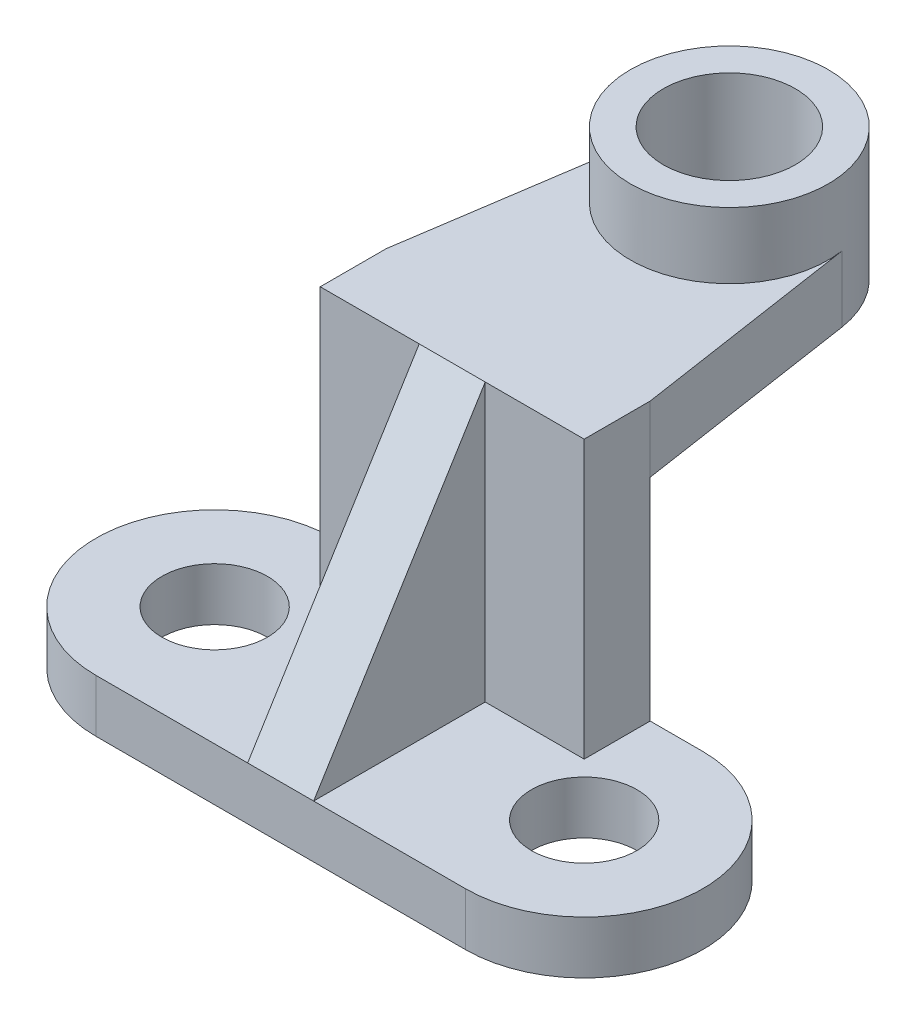
ISO-10303-21;
HEADER;
FILE_DESCRIPTION(('STEP AP214'),'2;1');
FILE_NAME('part.step','',(''),(''),'','','');
FILE_SCHEMA(('AUTOMOTIVE_DESIGN { 1 0 10303 214 1 1 1 1 }'));
ENDSEC;
DATA;
#1=APPLICATION_CONTEXT('core data for automotive mechanical design processes');
#2=APPLICATION_PROTOCOL_DEFINITION('international standard','automotive_design',2000,#1);
#3=PRODUCT_CONTEXT('',#1,'mechanical');
#4=PRODUCT('Part','Part','',(#3));
#5=PRODUCT_RELATED_PRODUCT_CATEGORY('part','',(#4));
#6=PRODUCT_DEFINITION_FORMATION('','',#4);
#7=PRODUCT_DEFINITION_CONTEXT('part definition',#1,'design');
#8=PRODUCT_DEFINITION('design','',#6,#7);
#9=PRODUCT_DEFINITION_SHAPE('','',#8);
#10=(LENGTH_UNIT() NAMED_UNIT(*) SI_UNIT(.MILLI.,.METRE.));
#11=(NAMED_UNIT(*) PLANE_ANGLE_UNIT() SI_UNIT($,.RADIAN.));
#12=(NAMED_UNIT(*) SI_UNIT($,.STERADIAN.) SOLID_ANGLE_UNIT());
#13=UNCERTAINTY_MEASURE_WITH_UNIT(LENGTH_MEASURE(1.E-05),#10,'distance_accuracy_value','');
#14=(GEOMETRIC_REPRESENTATION_CONTEXT(3) GLOBAL_UNCERTAINTY_ASSIGNED_CONTEXT((#13)) GLOBAL_UNIT_ASSIGNED_CONTEXT((#10,
#11,#12)) REPRESENTATION_CONTEXT('',''));
#15=CARTESIAN_POINT('',(0.,0.,0.));
#16=DIRECTION('',(0.,0.,1.));
#17=DIRECTION('',(1.,0.,0.));
#18=AXIS2_PLACEMENT_3D('',#15,#16,#17);
#19=CARTESIAN_POINT('',(-28.,4.,0.));
#20=DIRECTION('',(0.,1.,0.));
#21=DIRECTION('',(0.,0.,1.));
#22=AXIS2_PLACEMENT_3D('',#19,#20,#21);
#23=PLANE('',#22);
#24=CARTESIAN_POINT('',(-28.,4.,0.));
#25=DIRECTION('',(0.,1.,0.));
#26=DIRECTION('',(0.,0.,1.));
#27=AXIS2_PLACEMENT_3D('',#24,#25,#26);
#28=CIRCLE('',#27,8.);
#29=CARTESIAN_POINT('',(-28.,4.,8.));
#30=VERTEX_POINT('',#29);
#31=EDGE_CURVE('E265',#30,#30,#28,.T.);
#32=ORIENTED_EDGE('',*,*,#31,.F.);
#33=EDGE_LOOP('',(#32));
#34=FACE_BOUND('',#33,.T.);
#35=DIRECTION('',(1.,0.,0.));
#36=VECTOR('',#35,1.);
#37=CARTESIAN_POINT('',(-28.,4.,18.));
#38=LINE('',#37,#36);
#39=CARTESIAN_POINT('',(-28.,4.,18.));
#40=VERTEX_POINT('',#39);
#41=CARTESIAN_POINT('',(-5.,4.,18.));
#42=VERTEX_POINT('',#41);
#43=EDGE_CURVE('E279',#40,#42,#38,.T.);
#44=ORIENTED_EDGE('',*,*,#43,.T.);
#45=DIRECTION('',(0.,0.,-1.));
#46=VECTOR('',#45,1.);
#47=CARTESIAN_POINT('',(-5.,4.,0.));
#48=LINE('',#47,#46);
#49=CARTESIAN_POINT('',(-5.,4.,-8.00000000000002));
#50=VERTEX_POINT('',#49);
#51=EDGE_CURVE('E164',#42,#50,#48,.T.);
#52=ORIENTED_EDGE('',*,*,#51,.T.);
#53=DIRECTION('',(1.,0.,0.));
#54=VECTOR('',#53,1.);
#55=CARTESIAN_POINT('',(-20.,4.,-8.00000000000002));
#56=LINE('',#55,#54);
#57=CARTESIAN_POINT('',(-20.,4.,-8.00000000000002));
#58=VERTEX_POINT('',#57);
#59=EDGE_CURVE('E173',#58,#50,#56,.T.);
#60=ORIENTED_EDGE('',*,*,#59,.F.);
#61=DIRECTION('',(0.,0.,1.));
#62=VECTOR('',#61,1.);
#63=CARTESIAN_POINT('',(-20.,4.,-8.00000000000002));
#64=LINE('',#63,#62);
#65=CARTESIAN_POINT('',(-20.,4.,-18.));
#66=VERTEX_POINT('',#65);
#67=EDGE_CURVE('E235',#66,#58,#64,.T.);
#68=ORIENTED_EDGE('',*,*,#67,.F.);
#69=DIRECTION('',(-1.,0.,0.));
#70=VECTOR('',#69,1.);
#71=CARTESIAN_POINT('',(-28.,4.,-18.));
#72=LINE('',#71,#70);
#73=CARTESIAN_POINT('',(-28.,4.,-18.));
#74=VERTEX_POINT('',#73);
#75=EDGE_CURVE('E286',#66,#74,#72,.T.);
#76=ORIENTED_EDGE('',*,*,#75,.T.);
#77=CARTESIAN_POINT('',(-28.,4.,0.));
#78=DIRECTION('',(0.,1.,0.));
#79=DIRECTION('',(0.,0.,1.));
#80=AXIS2_PLACEMENT_3D('',#77,#78,#79);
#81=CIRCLE('',#80,18.);
#82=EDGE_CURVE('E273',#74,#40,#81,.T.);
#83=ORIENTED_EDGE('',*,*,#82,.T.);
#84=EDGE_LOOP('',(#44,#52,#60,#68,#76,#83));
#85=FACE_BOUND('',#84,.T.);
#86=ADVANCED_FACE('F45',(#34,#85),#23,.T.);
#87=CARTESIAN_POINT('',(-20.,36.,-8.00000000000002));
#88=DIRECTION('',(0.,0.,-1.));
#89=DIRECTION('',(-1.,0.,0.));
#90=AXIS2_PLACEMENT_3D('',#87,#88,#89);
#91=PLANE('',#90);
#92=DIRECTION('',(0.,-1.,0.));
#93=VECTOR('',#92,1.);
#94=CARTESIAN_POINT('',(-5.,36.,-8.00000000000002));
#95=LINE('',#94,#93);
#96=CARTESIAN_POINT('',(-5.,46.,-8.00000000000002));
#97=VERTEX_POINT('',#96);
#98=EDGE_CURVE('E162',#97,#50,#95,.T.);
#99=ORIENTED_EDGE('',*,*,#98,.F.);
#100=DIRECTION('',(1.,0.,0.));
#101=VECTOR('',#100,1.);
#102=CARTESIAN_POINT('',(-20.,46.,-8.00000000000002));
#103=LINE('',#102,#101);
#104=CARTESIAN_POINT('',(-20.,46.,-8.00000000000002));
#105=VERTEX_POINT('',#104);
#106=EDGE_CURVE('E156',#105,#97,#103,.T.);
#107=ORIENTED_EDGE('',*,*,#106,.F.);
#108=DIRECTION('',(0.,-1.,0.));
#109=VECTOR('',#108,1.);
#110=CARTESIAN_POINT('',(-20.,36.,-8.00000000000002));
#111=LINE('',#110,#109);
#112=EDGE_CURVE('E245',#105,#58,#111,.T.);
#113=ORIENTED_EDGE('',*,*,#112,.T.);
#114=ORIENTED_EDGE('',*,*,#59,.T.);
#115=EDGE_LOOP('',(#99,#107,#113,#114));
#116=FACE_BOUND('',#115,.T.);
#117=ADVANCED_FACE('F170',(#116),#91,.F.);
#118=DIRECTION('',(0.,0.,-1.));
#119=VECTOR('',#118,1.);
#120=CARTESIAN_POINT('',(5.,4.,0.));
#121=LINE('',#120,#119);
#122=CARTESIAN_POINT('',(5.,4.,18.));
#123=VERTEX_POINT('',#122);
#124=CARTESIAN_POINT('',(5.,4.,-8.00000000000002));
#125=VERTEX_POINT('',#124);
#126=EDGE_CURVE('E395',#123,#125,#121,.T.);
#127=ORIENTED_EDGE('',*,*,#126,.F.);
#128=CARTESIAN_POINT('',(28.,4.,18.));
#129=VERTEX_POINT('',#128);
#130=EDGE_CURVE('E277',#123,#129,#38,.T.);
#131=ORIENTED_EDGE('',*,*,#130,.T.);
#132=CARTESIAN_POINT('',(28.,4.,0.));
#133=DIRECTION('',(0.,1.,0.));
#134=DIRECTION('',(0.,0.,1.));
#135=AXIS2_PLACEMENT_3D('',#132,#133,#134);
#136=CIRCLE('',#135,18.);
#137=CARTESIAN_POINT('',(28.,4.,-18.));
#138=VERTEX_POINT('',#137);
#139=EDGE_CURVE('E283',#129,#138,#136,.T.);
#140=ORIENTED_EDGE('',*,*,#139,.T.);
#141=CARTESIAN_POINT('',(20.,4.,-18.));
#142=VERTEX_POINT('',#141);
#143=EDGE_CURVE('E287',#138,#142,#72,.T.);
#144=ORIENTED_EDGE('',*,*,#143,.T.);
#145=DIRECTION('',(0.,0.,-1.));
#146=VECTOR('',#145,1.);
#147=CARTESIAN_POINT('',(20.,4.,-8.00000000000002));
#148=LINE('',#147,#146);
#149=CARTESIAN_POINT('',(20.,4.,-8.00000000000002));
#150=VERTEX_POINT('',#149);
#151=EDGE_CURVE('E231',#150,#142,#148,.T.);
#152=ORIENTED_EDGE('',*,*,#151,.F.);
#153=EDGE_CURVE('E69',#125,#150,#56,.T.);
#154=ORIENTED_EDGE('',*,*,#153,.F.);
#155=EDGE_LOOP('',(#127,#131,#140,#144,#152,#154));
#156=FACE_BOUND('',#155,.T.);
#157=CARTESIAN_POINT('',(28.,4.,0.));
#158=DIRECTION('',(0.,1.,0.));
#159=DIRECTION('',(0.,0.,1.));
#160=AXIS2_PLACEMENT_3D('',#157,#158,#159);
#161=CIRCLE('',#160,8.);
#162=CARTESIAN_POINT('',(28.,4.,7.99999999999999));
#163=VERTEX_POINT('',#162);
#164=EDGE_CURVE('E257',#163,#163,#161,.T.);
#165=ORIENTED_EDGE('',*,*,#164,.F.);
#166=EDGE_LOOP('',(#165));
#167=FACE_BOUND('',#166,.T.);
#168=ADVANCED_FACE('F380',(#156,#167),#23,.T.);
#169=CARTESIAN_POINT('',(-28.,-4.,0.));
#170=DIRECTION('',(0.,1.,0.));
#171=DIRECTION('',(0.,0.,1.));
#172=AXIS2_PLACEMENT_3D('',#169,#170,#171);
#173=PLANE('',#172);
#174=CARTESIAN_POINT('',(28.,-4.,0.));
#175=DIRECTION('',(0.,1.,0.));
#176=DIRECTION('',(0.,0.,1.));
#177=AXIS2_PLACEMENT_3D('',#174,#175,#176);
#178=CIRCLE('',#177,18.);
#179=CARTESIAN_POINT('',(28.,-4.,18.));
#180=VERTEX_POINT('',#179);
#181=CARTESIAN_POINT('',(28.,-4.,-18.));
#182=VERTEX_POINT('',#181);
#183=EDGE_CURVE('E297',#180,#182,#178,.T.);
#184=ORIENTED_EDGE('',*,*,#183,.F.);
#185=DIRECTION('',(1.,0.,0.));
#186=VECTOR('',#185,1.);
#187=CARTESIAN_POINT('',(-28.,-4.,18.));
#188=LINE('',#187,#186);
#189=CARTESIAN_POINT('',(-28.,-4.,18.));
#190=VERTEX_POINT('',#189);
#191=EDGE_CURVE('E294',#190,#180,#188,.T.);
#192=ORIENTED_EDGE('',*,*,#191,.F.);
#193=CARTESIAN_POINT('',(-28.,-4.,0.));
#194=DIRECTION('',(0.,1.,0.));
#195=DIRECTION('',(0.,0.,1.));
#196=AXIS2_PLACEMENT_3D('',#193,#194,#195);
#197=CIRCLE('',#196,18.);
#198=CARTESIAN_POINT('',(-28.,-4.,-18.));
#199=VERTEX_POINT('',#198);
#200=EDGE_CURVE('E269',#199,#190,#197,.T.);
#201=ORIENTED_EDGE('',*,*,#200,.F.);
#202=DIRECTION('',(-1.,0.,0.));
#203=VECTOR('',#202,1.);
#204=CARTESIAN_POINT('',(-28.,-4.,-18.));
#205=LINE('',#204,#203);
#206=EDGE_CURVE('E278',#182,#199,#205,.T.);
#207=ORIENTED_EDGE('',*,*,#206,.F.);
#208=EDGE_LOOP('',(#184,#192,#201,#207));
#209=FACE_BOUND('',#208,.T.);
#210=CARTESIAN_POINT('',(28.,-4.,0.));
#211=DIRECTION('',(0.,1.,0.));
#212=DIRECTION('',(0.,0.,1.));
#213=AXIS2_PLACEMENT_3D('',#210,#211,#212);
#214=CIRCLE('',#213,8.);
#215=CARTESIAN_POINT('',(28.,-4.,7.99999999999999));
#216=VERTEX_POINT('',#215);
#217=EDGE_CURVE('E256',#216,#216,#214,.T.);
#218=ORIENTED_EDGE('',*,*,#217,.T.);
#219=EDGE_LOOP('',(#218));
#220=FACE_BOUND('',#219,.T.);
#221=CARTESIAN_POINT('',(-28.,-4.,0.));
#222=DIRECTION('',(0.,1.,0.));
#223=DIRECTION('',(0.,0.,1.));
#224=AXIS2_PLACEMENT_3D('',#221,#222,#223);
#225=CIRCLE('',#224,8.);
#226=CARTESIAN_POINT('',(-28.,-4.,8.));
#227=VERTEX_POINT('',#226);
#228=EDGE_CURVE('E261',#227,#227,#225,.T.);
#229=ORIENTED_EDGE('',*,*,#228,.T.);
#230=EDGE_LOOP('',(#229));
#231=FACE_BOUND('',#230,.T.);
#232=ADVANCED_FACE('F320',(#209,#220,#231),#173,.F.);
#233=CARTESIAN_POINT('',(-28.,4.,0.));
#234=DIRECTION('',(0.,-1.,0.));
#235=DIRECTION('',(0.,0.,-1.));
#236=AXIS2_PLACEMENT_3D('',#233,#234,#235);
#237=CYLINDRICAL_SURFACE('',#236,18.);
#238=ORIENTED_EDGE('',*,*,#200,.T.);
#239=DIRECTION('',(0.,-1.,0.));
#240=VECTOR('',#239,1.);
#241=CARTESIAN_POINT('',(-28.,4.,18.));
#242=LINE('',#241,#240);
#243=EDGE_CURVE('E11',#40,#190,#242,.T.);
#244=ORIENTED_EDGE('',*,*,#243,.F.);
#245=ORIENTED_EDGE('',*,*,#82,.F.);
#246=DIRECTION('',(0.,-1.,0.));
#247=VECTOR('',#246,1.);
#248=CARTESIAN_POINT('',(-28.,4.,-18.));
#249=LINE('',#248,#247);
#250=EDGE_CURVE('E290',#74,#199,#249,.T.);
#251=ORIENTED_EDGE('',*,*,#250,.T.);
#252=EDGE_LOOP('',(#238,#244,#245,#251));
#253=FACE_BOUND('',#252,.T.);
#254=ADVANCED_FACE('F47',(#253),#237,.T.);
#255=CARTESIAN_POINT('',(-28.,4.,18.));
#256=DIRECTION('',(0.,0.,-1.));
#257=DIRECTION('',(-1.,0.,0.));
#258=AXIS2_PLACEMENT_3D('',#255,#256,#257);
#259=PLANE('',#258);
#260=ORIENTED_EDGE('',*,*,#130,.F.);
#261=DIRECTION('',(1.,0.,0.));
#262=VECTOR('',#261,1.);
#263=CARTESIAN_POINT('',(-28.,3.99999999999999,18.));
#264=LINE('',#263,#262);
#265=EDGE_CURVE('E423',#42,#123,#264,.T.);
#266=ORIENTED_EDGE('',*,*,#265,.F.);
#267=ORIENTED_EDGE('',*,*,#43,.F.);
#268=ORIENTED_EDGE('',*,*,#243,.T.);
#269=ORIENTED_EDGE('',*,*,#191,.T.);
#270=DIRECTION('',(0.,-1.,0.));
#271=VECTOR('',#270,1.);
#272=CARTESIAN_POINT('',(28.,4.,18.));
#273=LINE('',#272,#271);
#274=EDGE_CURVE('E54',#129,#180,#273,.T.);
#275=ORIENTED_EDGE('',*,*,#274,.F.);
#276=EDGE_LOOP('',(#260,#266,#267,#268,#269,#275));
#277=FACE_BOUND('',#276,.T.);
#278=ADVANCED_FACE('F422',(#277),#259,.F.);
#279=CARTESIAN_POINT('',(28.,4.,0.));
#280=DIRECTION('',(0.,-1.,0.));
#281=DIRECTION('',(0.,0.,-1.));
#282=AXIS2_PLACEMENT_3D('',#279,#280,#281);
#283=CYLINDRICAL_SURFACE('',#282,18.);
#284=ORIENTED_EDGE('',*,*,#183,.T.);
#285=DIRECTION('',(0.,-1.,0.));
#286=VECTOR('',#285,1.);
#287=CARTESIAN_POINT('',(28.,4.,-18.));
#288=LINE('',#287,#286);
#289=EDGE_CURVE('E305',#138,#182,#288,.T.);
#290=ORIENTED_EDGE('',*,*,#289,.F.);
#291=ORIENTED_EDGE('',*,*,#139,.F.);
#292=ORIENTED_EDGE('',*,*,#274,.T.);
#293=EDGE_LOOP('',(#284,#290,#291,#292));
#294=FACE_BOUND('',#293,.T.);
#295=ADVANCED_FACE('F314',(#294),#283,.T.);
#296=CARTESIAN_POINT('',(-28.,4.,-18.));
#297=DIRECTION('',(0.,0.,1.));
#298=DIRECTION('',(1.,0.,0.));
#299=AXIS2_PLACEMENT_3D('',#296,#297,#298);
#300=PLANE('',#299);
#301=ORIENTED_EDGE('',*,*,#206,.T.);
#302=ORIENTED_EDGE('',*,*,#250,.F.);
#303=ORIENTED_EDGE('',*,*,#75,.F.);
#304=DIRECTION('',(0.,-1.,0.));
#305=VECTOR('',#304,1.);
#306=CARTESIAN_POINT('',(-20.,36.,-18.));
#307=LINE('',#306,#305);
#308=CARTESIAN_POINT('',(-20.,36.,-18.));
#309=VERTEX_POINT('',#308);
#310=EDGE_CURVE('E248',#309,#66,#307,.T.);
#311=ORIENTED_EDGE('',*,*,#310,.F.);
#312=DIRECTION('',(-1.,0.,0.));
#313=VECTOR('',#312,1.);
#314=CARTESIAN_POINT('',(-20.,36.,-18.));
#315=LINE('',#314,#313);
#316=CARTESIAN_POINT('',(20.,36.,-18.));
#317=VERTEX_POINT('',#316);
#318=EDGE_CURVE('E227',#317,#309,#315,.T.);
#319=ORIENTED_EDGE('',*,*,#318,.F.);
#320=DIRECTION('',(0.,-1.,0.));
#321=VECTOR('',#320,1.);
#322=CARTESIAN_POINT('',(20.,36.,-18.));
#323=LINE('',#322,#321);
#324=EDGE_CURVE('E252',#317,#142,#323,.T.);
#325=ORIENTED_EDGE('',*,*,#324,.T.);
#326=ORIENTED_EDGE('',*,*,#143,.F.);
#327=ORIENTED_EDGE('',*,*,#289,.T.);
#328=EDGE_LOOP('',(#301,#302,#303,#311,#319,#325,#326,#327));
#329=FACE_BOUND('',#328,.T.);
#330=ADVANCED_FACE('F325',(#329),#300,.F.);
#331=CARTESIAN_POINT('',(-28.,4.,0.));
#332=DIRECTION('',(0.,-1.,0.));
#333=DIRECTION('',(0.,0.,-1.));
#334=AXIS2_PLACEMENT_3D('',#331,#332,#333);
#335=CYLINDRICAL_SURFACE('',#334,8.);
#336=ORIENTED_EDGE('',*,*,#31,.T.);
#337=EDGE_LOOP('',(#336));
#338=FACE_BOUND('',#337,.T.);
#339=ORIENTED_EDGE('',*,*,#228,.F.);
#340=EDGE_LOOP('',(#339));
#341=FACE_BOUND('',#340,.T.);
#342=ADVANCED_FACE('F402',(#338,#341),#335,.F.);
#343=CARTESIAN_POINT('',(28.,4.,0.));
#344=DIRECTION('',(0.,-1.,0.));
#345=DIRECTION('',(0.,0.,-1.));
#346=AXIS2_PLACEMENT_3D('',#343,#344,#345);
#347=CYLINDRICAL_SURFACE('',#346,8.);
#348=ORIENTED_EDGE('',*,*,#164,.T.);
#349=EDGE_LOOP('',(#348));
#350=FACE_BOUND('',#349,.T.);
#351=ORIENTED_EDGE('',*,*,#217,.F.);
#352=EDGE_LOOP('',(#351));
#353=FACE_BOUND('',#352,.T.);
#354=ADVANCED_FACE('F398',(#350,#353),#347,.F.);
#355=CARTESIAN_POINT('',(20.,36.,-8.00000000000002));
#356=DIRECTION('',(-1.,0.,0.));
#357=DIRECTION('',(0.,0.,1.));
#358=AXIS2_PLACEMENT_3D('',#355,#356,#357);
#359=PLANE('',#358);
#360=ORIENTED_EDGE('',*,*,#151,.T.);
#361=ORIENTED_EDGE('',*,*,#324,.F.);
#362=DIRECTION('',(0.,1.,0.));
#363=VECTOR('',#362,1.);
#364=CARTESIAN_POINT('',(20.,36.,-18.));
#365=LINE('',#364,#363);
#366=CARTESIAN_POINT('',(20.,46.,-18.));
#367=VERTEX_POINT('',#366);
#368=EDGE_CURVE('E209',#317,#367,#365,.T.);
#369=ORIENTED_EDGE('',*,*,#368,.T.);
#370=DIRECTION('',(0.,0.,-1.));
#371=VECTOR('',#370,1.);
#372=CARTESIAN_POINT('',(20.,46.,-8.00000000000002));
#373=LINE('',#372,#371);
#374=CARTESIAN_POINT('',(20.,46.,-8.00000000000002));
#375=VERTEX_POINT('',#374);
#376=EDGE_CURVE('E181',#375,#367,#373,.T.);
#377=ORIENTED_EDGE('',*,*,#376,.F.);
#378=DIRECTION('',(0.,-1.,0.));
#379=VECTOR('',#378,1.);
#380=CARTESIAN_POINT('',(20.,36.,-8.00000000000002));
#381=LINE('',#380,#379);
#382=EDGE_CURVE('E230',#375,#150,#381,.T.);
#383=ORIENTED_EDGE('',*,*,#382,.T.);
#384=EDGE_LOOP('',(#360,#361,#369,#377,#383));
#385=FACE_BOUND('',#384,.T.);
#386=ADVANCED_FACE('F401',(#385),#359,.F.);
#387=CARTESIAN_POINT('',(-20.,36.,-8.00000000000002));
#388=DIRECTION('',(1.,0.,0.));
#389=DIRECTION('',(0.,0.,-1.));
#390=AXIS2_PLACEMENT_3D('',#387,#388,#389);
#391=PLANE('',#390);
#392=ORIENTED_EDGE('',*,*,#67,.T.);
#393=ORIENTED_EDGE('',*,*,#112,.F.);
#394=DIRECTION('',(0.,0.,1.));
#395=VECTOR('',#394,1.);
#396=CARTESIAN_POINT('',(-20.,46.,-18.));
#397=LINE('',#396,#395);
#398=CARTESIAN_POINT('',(-20.,46.,-18.));
#399=VERTEX_POINT('',#398);
#400=EDGE_CURVE('E179',#399,#105,#397,.T.);
#401=ORIENTED_EDGE('',*,*,#400,.F.);
#402=DIRECTION('',(0.,1.,0.));
#403=VECTOR('',#402,1.);
#404=CARTESIAN_POINT('',(-20.,36.,-18.));
#405=LINE('',#404,#403);
#406=EDGE_CURVE('E236',#309,#399,#405,.T.);
#407=ORIENTED_EDGE('',*,*,#406,.F.);
#408=ORIENTED_EDGE('',*,*,#310,.T.);
#409=EDGE_LOOP('',(#392,#393,#401,#407,#408));
#410=FACE_BOUND('',#409,.T.);
#411=ADVANCED_FACE('F363',(#410),#391,.F.);
#412=CARTESIAN_POINT('',(5.,46.,-8.00000000000002));
#413=VERTEX_POINT('',#412);
#414=EDGE_CURVE('E157',#413,#375,#103,.T.);
#415=ORIENTED_EDGE('',*,*,#414,.F.);
#416=DIRECTION('',(0.,-1.,0.));
#417=VECTOR('',#416,1.);
#418=CARTESIAN_POINT('',(5.,36.,-8.00000000000002));
#419=LINE('',#418,#417);
#420=EDGE_CURVE('E421',#413,#125,#419,.T.);
#421=ORIENTED_EDGE('',*,*,#420,.T.);
#422=ORIENTED_EDGE('',*,*,#153,.T.);
#423=ORIENTED_EDGE('',*,*,#382,.F.);
#424=EDGE_LOOP('',(#415,#421,#422,#423));
#425=FACE_BOUND('',#424,.T.);
#426=ADVANCED_FACE('F373',(#425),#91,.F.);
#427=CARTESIAN_POINT('',(0.,36.,-50.));
#428=DIRECTION('',(0.,1.,0.));
#429=DIRECTION('',(0.,0.,1.));
#430=AXIS2_PLACEMENT_3D('',#427,#428,#429);
#431=PLANE('',#430);
#432=CARTESIAN_POINT('',(0.,36.,-50.));
#433=DIRECTION('',(0.,1.,0.));
#434=DIRECTION('',(0.,0.,1.));
#435=AXIS2_PLACEMENT_3D('',#432,#433,#434);
#436=CIRCLE('',#435,10.);
#437=CARTESIAN_POINT('',(0.,36.,-40.));
#438=VERTEX_POINT('',#437);
#439=EDGE_CURVE('E200',#438,#438,#436,.T.);
#440=ORIENTED_EDGE('',*,*,#439,.T.);
#441=EDGE_LOOP('',(#440));
#442=FACE_BOUND('',#441,.T.);
#443=ORIENTED_EDGE('',*,*,#318,.T.);
#444=DIRECTION('',(-0.149249710482606,0.,0.98879953677217));
#445=VECTOR('',#444,1.);
#446=CARTESIAN_POINT('',(-20.,36.,-18.));
#447=LINE('',#446,#445);
#448=CARTESIAN_POINT('',(-14.8319930515826,36.,-52.2387456572391));
#449=VERTEX_POINT('',#448);
#450=EDGE_CURVE('E206',#449,#309,#447,.T.);
#451=ORIENTED_EDGE('',*,*,#450,.F.);
#452=CARTESIAN_POINT('',(0.,36.,-50.));
#453=DIRECTION('',(0.,1.,0.));
#454=DIRECTION('',(0.,0.,1.));
#455=AXIS2_PLACEMENT_3D('',#452,#453,#454);
#456=CIRCLE('',#455,15.);
#457=CARTESIAN_POINT('',(14.8319930515826,36.,-52.2387456572391));
#458=VERTEX_POINT('',#457);
#459=EDGE_CURVE('E192',#458,#449,#456,.T.);
#460=ORIENTED_EDGE('',*,*,#459,.F.);
#461=DIRECTION('',(-0.149249710482606,0.,-0.98879953677217));
#462=VECTOR('',#461,1.);
#463=CARTESIAN_POINT('',(20.,36.,-18.));
#464=LINE('',#463,#462);
#465=EDGE_CURVE('E203',#317,#458,#464,.T.);
#466=ORIENTED_EDGE('',*,*,#465,.F.);
#467=EDGE_LOOP('',(#443,#451,#460,#466));
#468=FACE_BOUND('',#467,.T.);
#469=ADVANCED_FACE('F360',(#442,#468),#431,.F.);
#470=CARTESIAN_POINT('',(-20.,36.,-18.));
#471=DIRECTION('',(-0.98879953677217,0.,-0.149249710482606));
#472=DIRECTION('',(-0.149249710482606,0.,0.98879953677217));
#473=AXIS2_PLACEMENT_3D('',#470,#471,#472);
#474=PLANE('',#473);
#475=DIRECTION('',(-0.149249710482606,0.,0.98879953677217));
#476=VECTOR('',#475,1.);
#477=CARTESIAN_POINT('',(-20.,46.,-18.));
#478=LINE('',#477,#476);
#479=CARTESIAN_POINT('',(-14.8319930515826,46.,-52.2387456572391));
#480=VERTEX_POINT('',#479);
#481=EDGE_CURVE('E345',#480,#399,#478,.T.);
#482=ORIENTED_EDGE('',*,*,#481,.F.);
#483=DIRECTION('',(0.,1.,0.));
#484=VECTOR('',#483,1.);
#485=CARTESIAN_POINT('',(-14.8319930515826,36.,-52.2387456572391));
#486=LINE('',#485,#484);
#487=EDGE_CURVE('E223',#449,#480,#486,.T.);
#488=ORIENTED_EDGE('',*,*,#487,.F.);
#489=ORIENTED_EDGE('',*,*,#450,.T.);
#490=ORIENTED_EDGE('',*,*,#406,.T.);
#491=EDGE_LOOP('',(#482,#488,#489,#490));
#492=FACE_BOUND('',#491,.T.);
#493=ADVANCED_FACE('F364',(#492),#474,.T.);
#494=CARTESIAN_POINT('',(20.,36.,-18.));
#495=DIRECTION('',(0.98879953677217,0.,-0.149249710482606));
#496=DIRECTION('',(-0.149249710482606,0.,-0.98879953677217));
#497=AXIS2_PLACEMENT_3D('',#494,#495,#496);
#498=PLANE('',#497);
#499=DIRECTION('',(-0.149249710482606,0.,-0.98879953677217));
#500=VECTOR('',#499,1.);
#501=CARTESIAN_POINT('',(20.,46.,-18.));
#502=LINE('',#501,#500);
#503=CARTESIAN_POINT('',(14.8319930515826,46.,-52.2387456572391));
#504=VERTEX_POINT('',#503);
#505=EDGE_CURVE('E184',#367,#504,#502,.T.);
#506=ORIENTED_EDGE('',*,*,#505,.F.);
#507=ORIENTED_EDGE('',*,*,#368,.F.);
#508=ORIENTED_EDGE('',*,*,#465,.T.);
#509=DIRECTION('',(0.,1.,0.));
#510=VECTOR('',#509,1.);
#511=CARTESIAN_POINT('',(14.8319930515825,36.,-52.2387456572391));
#512=LINE('',#511,#510);
#513=EDGE_CURVE('E214',#458,#504,#512,.T.);
#514=ORIENTED_EDGE('',*,*,#513,.T.);
#515=EDGE_LOOP('',(#506,#507,#508,#514));
#516=FACE_BOUND('',#515,.T.);
#517=ADVANCED_FACE('F354',(#516),#498,.T.);
#518=CARTESIAN_POINT('',(0.,46.,-50.));
#519=DIRECTION('',(0.,1.,0.));
#520=DIRECTION('',(0.,0.,1.));
#521=AXIS2_PLACEMENT_3D('',#518,#519,#520);
#522=PLANE('',#521);
#523=CARTESIAN_POINT('',(0.,46.,-50.));
#524=DIRECTION('',(0.,-1.,0.));
#525=DIRECTION('',(0.,0.,1.));
#526=AXIS2_PLACEMENT_3D('',#523,#524,#525);
#527=CIRCLE('',#526,15.);
#528=EDGE_CURVE('E348',#504,#480,#527,.T.);
#529=ORIENTED_EDGE('',*,*,#528,.T.);
#530=ORIENTED_EDGE('',*,*,#481,.T.);
#531=ORIENTED_EDGE('',*,*,#400,.T.);
#532=ORIENTED_EDGE('',*,*,#106,.T.);
#533=EDGE_CURVE('E148',#97,#413,#103,.T.);
#534=ORIENTED_EDGE('',*,*,#533,.T.);
#535=ORIENTED_EDGE('',*,*,#414,.T.);
#536=ORIENTED_EDGE('',*,*,#376,.T.);
#537=ORIENTED_EDGE('',*,*,#505,.T.);
#538=EDGE_LOOP('',(#529,#530,#531,#532,#534,#535,#536,#537));
#539=FACE_BOUND('',#538,.T.);
#540=ADVANCED_FACE('F176',(#539),#522,.T.);
#541=CARTESIAN_POINT('',(0.,56.,-50.));
#542=DIRECTION('',(0.,-1.,0.));
#543=DIRECTION('',(0.,0.,-1.));
#544=AXIS2_PLACEMENT_3D('',#541,#542,#543);
#545=CYLINDRICAL_SURFACE('',#544,15.);
#546=ORIENTED_EDGE('',*,*,#487,.T.);
#547=ORIENTED_EDGE('',*,*,#528,.F.);
#548=ORIENTED_EDGE('',*,*,#513,.F.);
#549=ORIENTED_EDGE('',*,*,#459,.T.);
#550=EDGE_LOOP('',(#546,#547,#548,#549));
#551=FACE_BOUND('',#550,.T.);
#552=CARTESIAN_POINT('',(0.,56.,-50.));
#553=DIRECTION('',(0.,1.,0.));
#554=DIRECTION('',(0.,0.,1.));
#555=AXIS2_PLACEMENT_3D('',#552,#553,#554);
#556=CIRCLE('',#555,15.);
#557=CARTESIAN_POINT('',(0.,56.,-35.));
#558=VERTEX_POINT('',#557);
#559=EDGE_CURVE('E188',#558,#558,#556,.T.);
#560=ORIENTED_EDGE('',*,*,#559,.F.);
#561=EDGE_LOOP('',(#560));
#562=FACE_BOUND('',#561,.T.);
#563=ADVANCED_FACE('F357',(#551,#562),#545,.T.);
#564=CARTESIAN_POINT('',(0.,56.,-50.));
#565=DIRECTION('',(0.,1.,0.));
#566=DIRECTION('',(0.,0.,1.));
#567=AXIS2_PLACEMENT_3D('',#564,#565,#566);
#568=PLANE('',#567);
#569=CARTESIAN_POINT('',(0.,56.,-50.));
#570=DIRECTION('',(0.,1.,0.));
#571=DIRECTION('',(0.,0.,1.));
#572=AXIS2_PLACEMENT_3D('',#569,#570,#571);
#573=CIRCLE('',#572,10.);
#574=CARTESIAN_POINT('',(0.,56.,-40.));
#575=VERTEX_POINT('',#574);
#576=EDGE_CURVE('E197',#575,#575,#573,.T.);
#577=ORIENTED_EDGE('',*,*,#576,.F.);
#578=EDGE_LOOP('',(#577));
#579=FACE_BOUND('',#578,.T.);
#580=ORIENTED_EDGE('',*,*,#559,.T.);
#581=EDGE_LOOP('',(#580));
#582=FACE_BOUND('',#581,.T.);
#583=ADVANCED_FACE('F437',(#579,#582),#568,.T.);
#584=CARTESIAN_POINT('',(0.,56.,-50.));
#585=DIRECTION('',(0.,-1.,0.));
#586=DIRECTION('',(0.,0.,-1.));
#587=AXIS2_PLACEMENT_3D('',#584,#585,#586);
#588=CYLINDRICAL_SURFACE('',#587,10.);
#589=ORIENTED_EDGE('',*,*,#439,.F.);
#590=EDGE_LOOP('',(#589));
#591=FACE_BOUND('',#590,.T.);
#592=ORIENTED_EDGE('',*,*,#576,.T.);
#593=EDGE_LOOP('',(#592));
#594=FACE_BOUND('',#593,.T.);
#595=ADVANCED_FACE('F435',(#591,#594),#588,.F.);
#596=CARTESIAN_POINT('',(0.,46.,-8.00000000000002));
#597=DIRECTION('',(0.,0.526354614616296,0.850265146687861));
#598=DIRECTION('',(0.,-0.850265146687861,0.526354614616296));
#599=AXIS2_PLACEMENT_3D('',#596,#597,#598);
#600=PLANE('',#599);
#601=DIRECTION('',(0.,-0.850265146687861,0.526354614616296));
#602=VECTOR('',#601,1.);
#603=CARTESIAN_POINT('',(-5.,46.,-8.00000000000002));
#604=LINE('',#603,#602);
#605=EDGE_CURVE('E151',#97,#42,#604,.T.);
#606=ORIENTED_EDGE('',*,*,#605,.T.);
#607=ORIENTED_EDGE('',*,*,#265,.T.);
#608=DIRECTION('',(0.,-0.850265146687861,0.526354614616296));
#609=VECTOR('',#608,1.);
#610=CARTESIAN_POINT('',(5.,46.,-8.00000000000002));
#611=LINE('',#610,#609);
#612=EDGE_CURVE('E61',#413,#123,#611,.T.);
#613=ORIENTED_EDGE('',*,*,#612,.F.);
#614=ORIENTED_EDGE('',*,*,#533,.F.);
#615=EDGE_LOOP('',(#606,#607,#613,#614));
#616=FACE_BOUND('',#615,.T.);
#617=ADVANCED_FACE('F150',(#616),#600,.T.);
#618=CARTESIAN_POINT('',(5.,26.,-23.5));
#619=DIRECTION('',(1.,0.,0.));
#620=DIRECTION('',(0.,0.,-1.));
#621=AXIS2_PLACEMENT_3D('',#618,#619,#620);
#622=PLANE('',#621);
#623=ORIENTED_EDGE('',*,*,#612,.T.);
#624=ORIENTED_EDGE('',*,*,#126,.T.);
#625=ORIENTED_EDGE('',*,*,#420,.F.);
#626=EDGE_LOOP('',(#623,#624,#625));
#627=FACE_BOUND('',#626,.T.);
#628=ADVANCED_FACE('F580',(#627),#622,.T.);
#629=CARTESIAN_POINT('',(-5.,26.,-23.5));
#630=DIRECTION('',(1.,0.,0.));
#631=DIRECTION('',(0.,0.,-1.));
#632=AXIS2_PLACEMENT_3D('',#629,#630,#631);
#633=PLANE('',#632);
#634=ORIENTED_EDGE('',*,*,#51,.F.);
#635=ORIENTED_EDGE('',*,*,#605,.F.);
#636=ORIENTED_EDGE('',*,*,#98,.T.);
#637=EDGE_LOOP('',(#634,#635,#636));
#638=FACE_BOUND('',#637,.T.);
#639=ADVANCED_FACE('F161',(#638),#633,.F.);
#640=CLOSED_SHELL('',(#86,#117,#168,#232,#254,#278,#295,#330,#342,#354,#386,#411,#426,#469,#493,
#517,#540,#563,#583,#595,#617,#628,#639));
#641=MANIFOLD_SOLID_BREP('B2',#640);
#642=ADVANCED_BREP_SHAPE_REPRESENTATION('',(#18,#641),#14);
#643=SHAPE_DEFINITION_REPRESENTATION(#9,#642);
ENDSEC;
END-ISO-10303-21;
